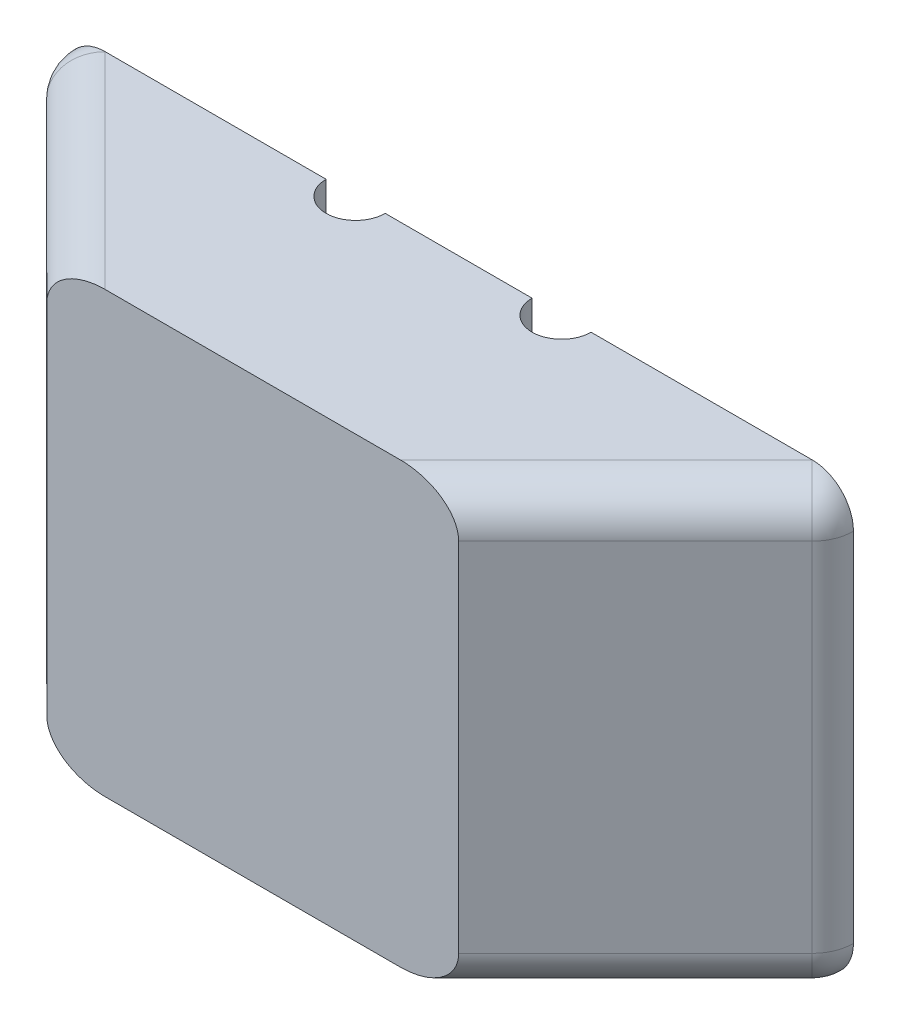
ISO-10303-21;
HEADER;
FILE_DESCRIPTION(('STEP AP214'),'2;1');
FILE_NAME('part.step','',(''),(''),'','','');
FILE_SCHEMA(('AUTOMOTIVE_DESIGN { 1 0 10303 214 1 1 1 1 }'));
ENDSEC;
DATA;
#1=APPLICATION_CONTEXT('core data for automotive mechanical design processes');
#2=APPLICATION_PROTOCOL_DEFINITION('international standard','automotive_design',2000,#1);
#3=PRODUCT_CONTEXT('',#1,'mechanical');
#4=PRODUCT('Part','Part','',(#3));
#5=PRODUCT_RELATED_PRODUCT_CATEGORY('part','',(#4));
#6=PRODUCT_DEFINITION_FORMATION('','',#4);
#7=PRODUCT_DEFINITION_CONTEXT('part definition',#1,'design');
#8=PRODUCT_DEFINITION('design','',#6,#7);
#9=PRODUCT_DEFINITION_SHAPE('','',#8);
#10=(LENGTH_UNIT() NAMED_UNIT(*) SI_UNIT(.MILLI.,.METRE.));
#11=(NAMED_UNIT(*) PLANE_ANGLE_UNIT() SI_UNIT($,.RADIAN.));
#12=(NAMED_UNIT(*) SI_UNIT($,.STERADIAN.) SOLID_ANGLE_UNIT());
#13=UNCERTAINTY_MEASURE_WITH_UNIT(LENGTH_MEASURE(1.E-05),#10,'distance_accuracy_value','');
#14=(GEOMETRIC_REPRESENTATION_CONTEXT(3) GLOBAL_UNCERTAINTY_ASSIGNED_CONTEXT((#13)) GLOBAL_UNIT_ASSIGNED_CONTEXT((#10,
#11,#12)) REPRESENTATION_CONTEXT('',''));
#15=CARTESIAN_POINT('',(0.,0.,0.));
#16=DIRECTION('',(0.,0.,1.));
#17=DIRECTION('',(1.,0.,0.));
#18=AXIS2_PLACEMENT_3D('',#15,#16,#17);
#19=CARTESIAN_POINT('',(-14.9906550373799,32.,15.0093449698787));
#20=DIRECTION('',(0.70666611811519,0.,-0.70754716981132));
#21=DIRECTION('',(-0.70754716981132,0.,-0.70666611811519));
#22=AXIS2_PLACEMENT_3D('',#19,#20,#21);
#23=PLANE('',#22);
#24=DIRECTION('',(0.,-1.,0.));
#25=VECTOR('',#24,1.);
#26=CARTESIAN_POINT('',(-27.877358490566,32.,2.13868829409393));
#27=LINE('',#26,#25);
#28=CARTESIAN_POINT('',(-27.877358490566,29.,2.13868829409393));
#29=VERTEX_POINT('',#28);
#30=CARTESIAN_POINT('',(-27.877358490566,3.,2.13868829409393));
#31=VERTEX_POINT('',#30);
#32=EDGE_CURVE('E286',#29,#31,#27,.T.);
#33=ORIENTED_EDGE('',*,*,#32,.T.);
#34=DIRECTION('',(0.70754716981132,0.,0.70666611811519));
#35=VECTOR('',#34,1.);
#36=CARTESIAN_POINT('',(-14.9906550373799,3.,15.0093449698787));
#37=LINE('',#36,#35);
#38=CARTESIAN_POINT('',(-15.,3.,15.0000116437904));
#39=VERTEX_POINT('',#38);
#40=EDGE_CURVE('E280',#31,#39,#37,.T.);
#41=ORIENTED_EDGE('',*,*,#40,.T.);
#42=DIRECTION('',(0.,-1.,0.));
#43=VECTOR('',#42,1.);
#44=CARTESIAN_POINT('',(-15.,32.,15.0000116437904));
#45=LINE('',#44,#43);
#46=CARTESIAN_POINT('',(-15.,29.,15.0000116437904));
#47=VERTEX_POINT('',#46);
#48=EDGE_CURVE('E300',#47,#39,#45,.T.);
#49=ORIENTED_EDGE('',*,*,#48,.F.);
#50=DIRECTION('',(0.70754716981132,0.,0.70666611811519));
#51=VECTOR('',#50,1.);
#52=CARTESIAN_POINT('',(-30.,29.,0.018689939748357));
#53=LINE('',#52,#51);
#54=EDGE_CURVE('E283',#47,#29,#53,.F.);
#55=ORIENTED_EDGE('',*,*,#54,.T.);
#56=EDGE_LOOP('',(#33,#41,#49,#55));
#57=FACE_BOUND('',#56,.T.);
#58=ADVANCED_FACE('F43',(#57),#23,.F.);
#59=CARTESIAN_POINT('',(0.,32.,15.0000116437904));
#60=DIRECTION('',(0.,0.,1.));
#61=DIRECTION('',(1.,0.,0.));
#62=AXIS2_PLACEMENT_3D('',#59,#60,#61);
#63=PLANE('',#62);
#64=ORIENTED_EDGE('',*,*,#48,.T.);
#65=CARTESIAN_POINT('',(-10.7547136857197,3.,15.0000116437904));
#66=DIRECTION('',(0.,0.,1.));
#67=DIRECTION('',(1.,0.,0.));
#68=AXIS2_PLACEMENT_3D('',#65,#66,#67);
#69=ELLIPSE('',#68,4.2452863142803,3.);
#70=CARTESIAN_POINT('',(-10.7547136857197,0.,15.0000116437904));
#71=VERTEX_POINT('',#70);
#72=EDGE_CURVE('E268',#39,#71,#69,.T.);
#73=ORIENTED_EDGE('',*,*,#72,.T.);
#74=DIRECTION('',(-1.,0.,0.));
#75=VECTOR('',#74,1.);
#76=CARTESIAN_POINT('',(0.,0.,15.0000116437904));
#77=LINE('',#76,#75);
#78=CARTESIAN_POINT('',(10.7547136857197,0.,15.0000116437904));
#79=VERTEX_POINT('',#78);
#80=EDGE_CURVE('E225',#79,#71,#77,.T.);
#81=ORIENTED_EDGE('',*,*,#80,.F.);
#82=CARTESIAN_POINT('',(10.7547136857197,3.,15.0000116437904));
#83=DIRECTION('',(0.,0.,1.));
#84=DIRECTION('',(1.,0.,0.));
#85=AXIS2_PLACEMENT_3D('',#82,#83,#84);
#86=ELLIPSE('',#85,4.2452863142803,3.);
#87=CARTESIAN_POINT('',(15.,3.,15.0000116437904));
#88=VERTEX_POINT('',#87);
#89=EDGE_CURVE('E277',#79,#88,#86,.T.);
#90=ORIENTED_EDGE('',*,*,#89,.T.);
#91=DIRECTION('',(0.,-1.,0.));
#92=VECTOR('',#91,1.);
#93=CARTESIAN_POINT('',(15.,32.,15.0000116437904));
#94=LINE('',#93,#92);
#95=CARTESIAN_POINT('',(15.,29.,15.0000116437904));
#96=VERTEX_POINT('',#95);
#97=EDGE_CURVE('E304',#96,#88,#94,.T.);
#98=ORIENTED_EDGE('',*,*,#97,.F.);
#99=CARTESIAN_POINT('',(10.7547136857197,29.,15.0000116437904));
#100=DIRECTION('',(0.,0.,1.));
#101=DIRECTION('',(-1.,0.,0.));
#102=AXIS2_PLACEMENT_3D('',#99,#100,#101);
#103=ELLIPSE('',#102,4.2452863142803,3.);
#104=CARTESIAN_POINT('',(10.7547136857197,32.,15.0000116437904));
#105=VERTEX_POINT('',#104);
#106=EDGE_CURVE('E274',#96,#105,#103,.T.);
#107=ORIENTED_EDGE('',*,*,#106,.T.);
#108=DIRECTION('',(-1.,0.,0.));
#109=VECTOR('',#108,1.);
#110=CARTESIAN_POINT('',(0.,32.,15.0000116437904));
#111=LINE('',#110,#109);
#112=CARTESIAN_POINT('',(-10.7547136857197,32.,15.0000116437904));
#113=VERTEX_POINT('',#112);
#114=EDGE_CURVE('E308',#105,#113,#111,.T.);
#115=ORIENTED_EDGE('',*,*,#114,.T.);
#116=CARTESIAN_POINT('',(-10.7547136857197,29.,15.0000116437904));
#117=DIRECTION('',(0.,0.,1.));
#118=DIRECTION('',(-1.,0.,0.));
#119=AXIS2_PLACEMENT_3D('',#116,#117,#118);
#120=ELLIPSE('',#119,4.2452863142803,3.);
#121=EDGE_CURVE('E271',#113,#47,#120,.T.);
#122=ORIENTED_EDGE('',*,*,#121,.T.);
#123=EDGE_LOOP('',(#64,#73,#81,#90,#98,#107,#115,#122));
#124=FACE_BOUND('',#123,.T.);
#125=ADVANCED_FACE('F424',(#124),#63,.T.);
#126=CARTESIAN_POINT('',(14.9906550373799,32.,15.0093449698787));
#127=DIRECTION('',(0.70666611811519,0.,0.70754716981132));
#128=DIRECTION('',(0.70754716981132,0.,-0.70666611811519));
#129=AXIS2_PLACEMENT_3D('',#126,#127,#128);
#130=PLANE('',#129);
#131=DIRECTION('',(0.,-1.,0.));
#132=VECTOR('',#131,1.);
#133=CARTESIAN_POINT('',(27.877358490566,32.,2.13868829409393));
#134=LINE('',#133,#132);
#135=CARTESIAN_POINT('',(27.877358490566,3.,2.13868829409393));
#136=VERTEX_POINT('',#135);
#137=CARTESIAN_POINT('',(27.877358490566,29.,2.13868829409393));
#138=VERTEX_POINT('',#137);
#139=EDGE_CURVE('E247',#136,#138,#134,.F.);
#140=ORIENTED_EDGE('',*,*,#139,.T.);
#141=DIRECTION('',(-0.70754716981132,0.,0.70666611811519));
#142=VECTOR('',#141,1.);
#143=CARTESIAN_POINT('',(14.9906550373799,29.,15.0093449698787));
#144=LINE('',#143,#142);
#145=EDGE_CURVE('E178',#138,#96,#144,.T.);
#146=ORIENTED_EDGE('',*,*,#145,.T.);
#147=ORIENTED_EDGE('',*,*,#97,.T.);
#148=DIRECTION('',(-0.70754716981132,0.,0.70666611811519));
#149=VECTOR('',#148,1.);
#150=CARTESIAN_POINT('',(30.,3.,0.0186899397483501));
#151=LINE('',#150,#149);
#152=EDGE_CURVE('E251',#88,#136,#151,.F.);
#153=ORIENTED_EDGE('',*,*,#152,.T.);
#154=EDGE_LOOP('',(#140,#146,#147,#153));
#155=FACE_BOUND('',#154,.T.);
#156=ADVANCED_FACE('F393',(#155),#130,.T.);
#157=CARTESIAN_POINT('',(0.,32.,0.));
#158=DIRECTION('',(0.,1.,0.));
#159=DIRECTION('',(0.,0.,1.));
#160=AXIS2_PLACEMENT_3D('',#157,#158,#159);
#161=PLANE('',#160);
#162=DIRECTION('',(1.,0.,0.));
#163=VECTOR('',#162,1.);
#164=CARTESIAN_POINT('',(0.,32.,0.));
#165=LINE('',#164,#163);
#166=CARTESIAN_POINT('',(-25.7413333333334,32.,0.));
#167=VERTEX_POINT('',#166);
#168=CARTESIAN_POINT('',(-9.64999346728504,32.,0.));
#169=VERTEX_POINT('',#168);
#170=EDGE_CURVE('E172',#167,#169,#165,.T.);
#171=ORIENTED_EDGE('',*,*,#170,.F.);
#172=DIRECTION('',(-0.706666118115192,0.,0.707547169811318));
#173=VECTOR('',#172,1.);
#174=CARTESIAN_POINT('',(-27.8773584905661,32.,2.13868829409393));
#175=LINE('',#174,#173);
#176=CARTESIAN_POINT('',(-25.7573601362205,32.,0.0160467846599707));
#177=VERTEX_POINT('',#176);
#178=EDGE_CURVE('E257',#167,#177,#175,.T.);
#179=ORIENTED_EDGE('',*,*,#178,.T.);
#180=DIRECTION('',(0.70754716981132,0.,0.70666611811519));
#181=VECTOR('',#180,1.);
#182=CARTESIAN_POINT('',(-12.8800016456545,32.,12.8773701343564));
#183=LINE('',#182,#181);
#184=EDGE_CURVE('E254',#177,#113,#183,.T.);
#185=ORIENTED_EDGE('',*,*,#184,.T.);
#186=ORIENTED_EDGE('',*,*,#114,.F.);
#187=DIRECTION('',(-0.70754716981132,0.,0.70666611811519));
#188=VECTOR('',#187,1.);
#189=CARTESIAN_POINT('',(12.8706566830343,32.,12.8867034604447));
#190=LINE('',#189,#188);
#191=CARTESIAN_POINT('',(25.7573601362205,32.,0.0160467846599665));
#192=VERTEX_POINT('',#191);
#193=EDGE_CURVE('E260',#105,#192,#190,.F.);
#194=ORIENTED_EDGE('',*,*,#193,.T.);
#195=DIRECTION('',(0.706666118115192,0.,0.707547169811318));
#196=VECTOR('',#195,1.);
#197=CARTESIAN_POINT('',(12.8867034531861,32.,-12.8706566757848));
#198=LINE('',#197,#196);
#199=CARTESIAN_POINT('',(25.7413333333334,32.,0.));
#200=VERTEX_POINT('',#199);
#201=EDGE_CURVE('E264',#192,#200,#198,.F.);
#202=ORIENTED_EDGE('',*,*,#201,.T.);
#203=CARTESIAN_POINT('',(9.6499949227572,32.,0.));
#204=VERTEX_POINT('',#203);
#205=EDGE_CURVE('E336',#204,#200,#165,.T.);
#206=ORIENTED_EDGE('',*,*,#205,.F.);
#207=CARTESIAN_POINT('',(7.5,32.,-0.00467248523580413));
#208=DIRECTION('',(0.,1.,0.));
#209=DIRECTION('',(0.,0.,1.));
#210=AXIS2_PLACEMENT_3D('',#207,#208,#209);
#211=CIRCLE('',#210,2.15);
#212=CARTESIAN_POINT('',(5.3500050772428,32.,0.));
#213=VERTEX_POINT('',#212);
#214=EDGE_CURVE('E315',#213,#204,#211,.T.);
#215=ORIENTED_EDGE('',*,*,#214,.F.);
#216=CARTESIAN_POINT('',(-5.3500036217667,32.,0.));
#217=VERTEX_POINT('',#216);
#218=EDGE_CURVE('E344',#217,#213,#165,.T.);
#219=ORIENTED_EDGE('',*,*,#218,.F.);
#220=CARTESIAN_POINT('',(-7.49999854452587,32.,0.00467248432904661));
#221=DIRECTION('',(0.,1.,0.));
#222=DIRECTION('',(0.,0.,1.));
#223=AXIS2_PLACEMENT_3D('',#220,#221,#222);
#224=CIRCLE('',#223,2.15);
#225=EDGE_CURVE('E200',#169,#217,#224,.T.);
#226=ORIENTED_EDGE('',*,*,#225,.F.);
#227=EDGE_LOOP('',(#171,#179,#185,#186,#194,#202,#206,#215,#219,#226));
#228=FACE_BOUND('',#227,.T.);
#229=ADVANCED_FACE('F408',(#228),#161,.T.);
#230=CARTESIAN_POINT('',(0.,0.,0.));
#231=DIRECTION('',(0.,1.,0.));
#232=DIRECTION('',(0.,0.,1.));
#233=AXIS2_PLACEMENT_3D('',#230,#231,#232);
#234=PLANE('',#233);
#235=DIRECTION('',(-0.706666118115192,0.,0.707547169811318));
#236=VECTOR('',#235,1.);
#237=CARTESIAN_POINT('',(-12.8867034531861,0.,-12.8706566757848));
#238=LINE('',#237,#236);
#239=CARTESIAN_POINT('',(-25.7573601362205,0.,0.0160467846599734));
#240=VERTEX_POINT('',#239);
#241=CARTESIAN_POINT('',(-25.7413333333334,0.,0.));
#242=VERTEX_POINT('',#241);
#243=EDGE_CURVE('E185',#240,#242,#238,.F.);
#244=ORIENTED_EDGE('',*,*,#243,.T.);
#245=DIRECTION('',(1.,0.,0.));
#246=VECTOR('',#245,1.);
#247=CARTESIAN_POINT('',(0.,0.,0.));
#248=LINE('',#247,#246);
#249=CARTESIAN_POINT('',(-9.64999346728504,0.,0.));
#250=VERTEX_POINT('',#249);
#251=EDGE_CURVE('E169',#242,#250,#248,.T.);
#252=ORIENTED_EDGE('',*,*,#251,.T.);
#253=CARTESIAN_POINT('',(-7.49999854452587,0.,0.00467248432904661));
#254=DIRECTION('',(0.,1.,0.));
#255=DIRECTION('',(0.,0.,1.));
#256=AXIS2_PLACEMENT_3D('',#253,#254,#255);
#257=CIRCLE('',#256,2.15);
#258=CARTESIAN_POINT('',(-5.3500036217667,0.,0.));
#259=VERTEX_POINT('',#258);
#260=EDGE_CURVE('E183',#250,#259,#257,.T.);
#261=ORIENTED_EDGE('',*,*,#260,.T.);
#262=CARTESIAN_POINT('',(5.3500050772428,0.,0.));
#263=VERTEX_POINT('',#262);
#264=EDGE_CURVE('E67',#259,#263,#248,.T.);
#265=ORIENTED_EDGE('',*,*,#264,.T.);
#266=CARTESIAN_POINT('',(7.5,0.,-0.00467248523580413));
#267=DIRECTION('',(0.,1.,0.));
#268=DIRECTION('',(0.,0.,1.));
#269=AXIS2_PLACEMENT_3D('',#266,#267,#268);
#270=CIRCLE('',#269,2.15);
#271=CARTESIAN_POINT('',(9.6499949227572,0.,0.));
#272=VERTEX_POINT('',#271);
#273=EDGE_CURVE('E191',#263,#272,#270,.T.);
#274=ORIENTED_EDGE('',*,*,#273,.T.);
#275=CARTESIAN_POINT('',(25.7413333333334,0.,0.));
#276=VERTEX_POINT('',#275);
#277=EDGE_CURVE('E59',#272,#276,#248,.T.);
#278=ORIENTED_EDGE('',*,*,#277,.T.);
#279=DIRECTION('',(0.706666118115192,0.,0.707547169811318));
#280=VECTOR('',#279,1.);
#281=CARTESIAN_POINT('',(27.8773584905661,0.,2.13868829409393));
#282=LINE('',#281,#280);
#283=CARTESIAN_POINT('',(25.7573601362205,0.,0.016046784659967));
#284=VERTEX_POINT('',#283);
#285=EDGE_CURVE('E294',#276,#284,#282,.T.);
#286=ORIENTED_EDGE('',*,*,#285,.T.);
#287=DIRECTION('',(-0.70754716981132,0.,0.70666611811519));
#288=VECTOR('',#287,1.);
#289=CARTESIAN_POINT('',(12.8800016456545,0.,12.8773701343564));
#290=LINE('',#289,#288);
#291=EDGE_CURVE('E297',#284,#79,#290,.T.);
#292=ORIENTED_EDGE('',*,*,#291,.T.);
#293=ORIENTED_EDGE('',*,*,#80,.T.);
#294=DIRECTION('',(0.70754716981132,0.,0.70666611811519));
#295=VECTOR('',#294,1.);
#296=CARTESIAN_POINT('',(-12.8706566830343,0.,12.8867034604447));
#297=LINE('',#296,#295);
#298=EDGE_CURVE('E291',#71,#240,#297,.F.);
#299=ORIENTED_EDGE('',*,*,#298,.T.);
#300=EDGE_LOOP('',(#244,#252,#261,#265,#274,#278,#286,#292,#293,#299));
#301=FACE_BOUND('',#300,.T.);
#302=ADVANCED_FACE('F182',(#301),#234,.F.);
#303=CARTESIAN_POINT('',(-12.8867034531861,29.,-12.8706566757848));
#304=DIRECTION('',(0.706666118115192,0.,-0.707547169811318));
#305=DIRECTION('',(-0.707547169811318,0.,-0.706666118115192));
#306=AXIS2_PLACEMENT_3D('',#303,#304,#305);
#307=CYLINDRICAL_SURFACE('',#306,3.);
#308=CARTESIAN_POINT('',(-25.7413333333334,29.,0.));
#309=DIRECTION('',(0.,0.,1.));
#310=DIRECTION('',(1.,0.,0.));
#311=AXIS2_PLACEMENT_3D('',#308,#309,#310);
#312=ELLIPSE('',#311,4.24000000000002,3.);
#313=CARTESIAN_POINT('',(-25.773426927566,31.9999140585887,0.));
#314=VERTEX_POINT('',#313);
#315=EDGE_CURVE('E345',#314,#167,#312,.F.);
#316=ORIENTED_EDGE('',*,*,#315,.F.);
#317=CARTESIAN_POINT('',(-25.7573601362205,29.,0.0160467846599707));
#318=DIRECTION('',(-0.706666118115192,0.,0.707547169811318));
#319=DIRECTION('',(0.707547169811318,0.,0.706666118115192));
#320=AXIS2_PLACEMENT_3D('',#317,#318,#319);
#321=CIRCLE('',#320,3.);
#322=EDGE_CURVE('E221',#177,#314,#321,.T.);
#323=ORIENTED_EDGE('',*,*,#322,.F.);
#324=ORIENTED_EDGE('',*,*,#178,.F.);
#325=EDGE_LOOP('',(#316,#323,#324));
#326=FACE_BOUND('',#325,.T.);
#327=ADVANCED_FACE('F457',(#326),#307,.T.);
#328=CARTESIAN_POINT('',(-12.8706566830343,29.,12.8867034604447));
#329=DIRECTION('',(-0.70754716981132,0.,-0.70666611811519));
#330=DIRECTION('',(-0.70666611811519,0.,0.70754716981132));
#331=AXIS2_PLACEMENT_3D('',#328,#329,#330);
#332=CYLINDRICAL_SURFACE('',#331,3.);
#333=ORIENTED_EDGE('',*,*,#121,.F.);
#334=ORIENTED_EDGE('',*,*,#184,.F.);
#335=CARTESIAN_POINT('',(-25.7573601362205,29.,0.0160467846599724));
#336=DIRECTION('',(-0.70754716981132,0.,-0.706666118115189));
#337=DIRECTION('',(-0.706666118115189,0.,0.70754716981132));
#338=AXIS2_PLACEMENT_3D('',#335,#336,#337);
#339=CIRCLE('',#338,3.);
#340=EDGE_CURVE('E226',#29,#177,#339,.T.);
#341=ORIENTED_EDGE('',*,*,#340,.F.);
#342=ORIENTED_EDGE('',*,*,#54,.F.);
#343=EDGE_LOOP('',(#333,#334,#341,#342));
#344=FACE_BOUND('',#343,.T.);
#345=ADVANCED_FACE('F453',(#344),#332,.T.);
#346=CARTESIAN_POINT('',(-25.7573601362205,29.,0.0160467846599713));
#347=DIRECTION('',(0.,1.,0.));
#348=DIRECTION('',(-1.,0.,0.));
#349=AXIS2_PLACEMENT_3D('',#346,#347,#348);
#350=SPHERICAL_SURFACE('',#349,3.);
#351=CARTESIAN_POINT('',(-25.7573601362205,29.,0.));
#352=DIRECTION('',(0.,0.,1.));
#353=DIRECTION('',(1.,0.,0.));
#354=AXIS2_PLACEMENT_3D('',#351,#352,#353);
#355=CIRCLE('',#354,2.99995708314337);
#356=CARTESIAN_POINT('',(-28.7573172193638,29.,0.));
#357=VERTEX_POINT('',#356);
#358=EDGE_CURVE('E348',#357,#314,#355,.F.);
#359=ORIENTED_EDGE('',*,*,#358,.F.);
#360=CARTESIAN_POINT('',(-25.7573601362205,29.,0.0160467846599707));
#361=DIRECTION('',(0.,1.,0.));
#362=DIRECTION('',(0.,0.,1.));
#363=AXIS2_PLACEMENT_3D('',#360,#361,#362);
#364=CIRCLE('',#363,3.);
#365=EDGE_CURVE('E230',#29,#357,#364,.F.);
#366=ORIENTED_EDGE('',*,*,#365,.F.);
#367=ORIENTED_EDGE('',*,*,#340,.T.);
#368=ORIENTED_EDGE('',*,*,#322,.T.);
#369=EDGE_LOOP('',(#359,#366,#367,#368));
#370=FACE_BOUND('',#369,.T.);
#371=ADVANCED_FACE('F449',(#370),#350,.T.);
#372=CARTESIAN_POINT('',(-25.7573601362205,32.,0.0160467846599711));
#373=DIRECTION('',(0.,-1.,0.));
#374=DIRECTION('',(0.,0.,-1.));
#375=AXIS2_PLACEMENT_3D('',#372,#373,#374);
#376=CYLINDRICAL_SURFACE('',#375,3.);
#377=DIRECTION('',(0.,-1.,0.));
#378=VECTOR('',#377,1.);
#379=CARTESIAN_POINT('',(-28.7573172193638,32.,0.));
#380=LINE('',#379,#378);
#381=CARTESIAN_POINT('',(-28.7573172193638,3.,0.));
#382=VERTEX_POINT('',#381);
#383=EDGE_CURVE('E351',#382,#357,#380,.F.);
#384=ORIENTED_EDGE('',*,*,#383,.F.);
#385=CARTESIAN_POINT('',(-25.7573601362205,3.,0.016046784659972));
#386=DIRECTION('',(0.,-1.,0.));
#387=DIRECTION('',(0.,0.,-1.));
#388=AXIS2_PLACEMENT_3D('',#385,#386,#387);
#389=CIRCLE('',#388,3.);
#390=EDGE_CURVE('E234',#31,#382,#389,.T.);
#391=ORIENTED_EDGE('',*,*,#390,.F.);
#392=ORIENTED_EDGE('',*,*,#32,.F.);
#393=ORIENTED_EDGE('',*,*,#365,.T.);
#394=EDGE_LOOP('',(#384,#391,#392,#393));
#395=FACE_BOUND('',#394,.T.);
#396=ADVANCED_FACE('F445',(#395),#376,.T.);
#397=CARTESIAN_POINT('',(-12.8706566830343,3.,12.8867034604447));
#398=DIRECTION('',(0.70754716981132,0.,0.70666611811519));
#399=DIRECTION('',(0.70666611811519,0.,-0.70754716981132));
#400=AXIS2_PLACEMENT_3D('',#397,#398,#399);
#401=CYLINDRICAL_SURFACE('',#400,3.);
#402=ORIENTED_EDGE('',*,*,#72,.F.);
#403=ORIENTED_EDGE('',*,*,#40,.F.);
#404=CARTESIAN_POINT('',(-25.7573601362205,3.,0.0160467846599734));
#405=DIRECTION('',(-0.707547169811321,0.,-0.706666118115189));
#406=DIRECTION('',(-0.706666118115189,0.,0.707547169811321));
#407=AXIS2_PLACEMENT_3D('',#404,#405,#406);
#408=CIRCLE('',#407,3.);
#409=EDGE_CURVE('E238',#240,#31,#408,.T.);
#410=ORIENTED_EDGE('',*,*,#409,.F.);
#411=ORIENTED_EDGE('',*,*,#298,.F.);
#412=EDGE_LOOP('',(#402,#403,#410,#411));
#413=FACE_BOUND('',#412,.T.);
#414=ADVANCED_FACE('F441',(#413),#401,.T.);
#415=CARTESIAN_POINT('',(-25.7573601362205,3.,0.016046784659971));
#416=DIRECTION('',(-0.706666118115189,0.,0.70754716981132));
#417=DIRECTION('',(0.70754716981132,0.,0.706666118115189));
#418=AXIS2_PLACEMENT_3D('',#415,#416,#417);
#419=SPHERICAL_SURFACE('',#418,3.);
#420=CARTESIAN_POINT('',(-25.7573601362205,3.,0.));
#421=DIRECTION('',(0.,0.,1.));
#422=DIRECTION('',(1.,0.,0.));
#423=AXIS2_PLACEMENT_3D('',#420,#421,#422);
#424=CIRCLE('',#423,2.99995708314337);
#425=CARTESIAN_POINT('',(-25.773426927566,8.59414113311974E-05,0.));
#426=VERTEX_POINT('',#425);
#427=EDGE_CURVE('E354',#426,#382,#424,.F.);
#428=ORIENTED_EDGE('',*,*,#427,.F.);
#429=CARTESIAN_POINT('',(-25.7573601362205,3.,0.0160467846599711));
#430=DIRECTION('',(-0.706666118115192,0.,0.707547169811318));
#431=DIRECTION('',(0.707547169811318,0.,0.706666118115192));
#432=AXIS2_PLACEMENT_3D('',#429,#430,#431);
#433=CIRCLE('',#432,3.);
#434=EDGE_CURVE('E207',#240,#426,#433,.F.);
#435=ORIENTED_EDGE('',*,*,#434,.F.);
#436=ORIENTED_EDGE('',*,*,#409,.T.);
#437=ORIENTED_EDGE('',*,*,#390,.T.);
#438=EDGE_LOOP('',(#428,#435,#436,#437));
#439=FACE_BOUND('',#438,.T.);
#440=ADVANCED_FACE('F437',(#439),#419,.T.);
#441=CARTESIAN_POINT('',(-12.8867034531861,3.,-12.8706566757848));
#442=DIRECTION('',(-0.706666118115192,0.,0.707547169811318));
#443=DIRECTION('',(0.707547169811318,0.,0.706666118115192));
#444=AXIS2_PLACEMENT_3D('',#441,#442,#443);
#445=CYLINDRICAL_SURFACE('',#444,3.);
#446=CARTESIAN_POINT('',(-25.7413333333334,3.,0.));
#447=DIRECTION('',(0.,0.,1.));
#448=DIRECTION('',(-1.,0.,0.));
#449=AXIS2_PLACEMENT_3D('',#446,#447,#448);
#450=ELLIPSE('',#449,4.24000000000002,3.);
#451=EDGE_CURVE('E357',#242,#426,#450,.F.);
#452=ORIENTED_EDGE('',*,*,#451,.F.);
#453=ORIENTED_EDGE('',*,*,#243,.F.);
#454=ORIENTED_EDGE('',*,*,#434,.T.);
#455=EDGE_LOOP('',(#452,#453,#454));
#456=FACE_BOUND('',#455,.T.);
#457=ADVANCED_FACE('F434',(#456),#445,.T.);
#458=CARTESIAN_POINT('',(12.8706566830343,29.,12.8867034604447));
#459=DIRECTION('',(-0.70754716981132,0.,0.70666611811519));
#460=DIRECTION('',(0.70666611811519,0.,0.70754716981132));
#461=AXIS2_PLACEMENT_3D('',#458,#459,#460);
#462=CYLINDRICAL_SURFACE('',#461,3.);
#463=ORIENTED_EDGE('',*,*,#106,.F.);
#464=ORIENTED_EDGE('',*,*,#145,.F.);
#465=CARTESIAN_POINT('',(25.7573601362205,29.,0.0160467846599678));
#466=DIRECTION('',(0.707547169811319,0.,-0.70666611811519));
#467=DIRECTION('',(-0.70666611811519,0.,-0.707547169811319));
#468=AXIS2_PLACEMENT_3D('',#465,#466,#467);
#469=CIRCLE('',#468,3.);
#470=EDGE_CURVE('E203',#192,#138,#469,.T.);
#471=ORIENTED_EDGE('',*,*,#470,.F.);
#472=ORIENTED_EDGE('',*,*,#193,.F.);
#473=EDGE_LOOP('',(#463,#464,#471,#472));
#474=FACE_BOUND('',#473,.T.);
#475=ADVANCED_FACE('F45',(#474),#462,.T.);
#476=CARTESIAN_POINT('',(12.8867034531861,29.,-12.8706566757848));
#477=DIRECTION('',(0.706666118115192,0.,0.707547169811318));
#478=DIRECTION('',(0.707547169811318,0.,-0.706666118115192));
#479=AXIS2_PLACEMENT_3D('',#476,#477,#478);
#480=CYLINDRICAL_SURFACE('',#479,3.);
#481=CARTESIAN_POINT('',(25.7413333333334,29.,0.));
#482=DIRECTION('',(0.,0.,1.));
#483=DIRECTION('',(1.,0.,0.));
#484=AXIS2_PLACEMENT_3D('',#481,#482,#483);
#485=ELLIPSE('',#484,4.24000000000002,3.);
#486=CARTESIAN_POINT('',(25.773426927566,31.9999140585887,0.));
#487=VERTEX_POINT('',#486);
#488=EDGE_CURVE('E330',#200,#487,#485,.F.);
#489=ORIENTED_EDGE('',*,*,#488,.F.);
#490=ORIENTED_EDGE('',*,*,#201,.F.);
#491=CARTESIAN_POINT('',(25.7573601362205,29.,0.0160467846599677));
#492=DIRECTION('',(0.706666118115192,0.,0.707547169811317));
#493=DIRECTION('',(0.707547169811317,0.,-0.706666118115192));
#494=AXIS2_PLACEMENT_3D('',#491,#492,#493);
#495=CIRCLE('',#494,3.);
#496=EDGE_CURVE('E208',#487,#192,#495,.T.);
#497=ORIENTED_EDGE('',*,*,#496,.F.);
#498=EDGE_LOOP('',(#489,#490,#497));
#499=FACE_BOUND('',#498,.T.);
#500=ADVANCED_FACE('F410',(#499),#480,.T.);
#501=CARTESIAN_POINT('',(12.8867034531861,3.,-12.8706566757848));
#502=DIRECTION('',(-0.706666118115192,0.,-0.707547169811318));
#503=DIRECTION('',(-0.707547169811318,0.,0.706666118115192));
#504=AXIS2_PLACEMENT_3D('',#501,#502,#503);
#505=CYLINDRICAL_SURFACE('',#504,3.);
#506=CARTESIAN_POINT('',(25.7413333333334,3.,0.));
#507=DIRECTION('',(0.,0.,1.));
#508=DIRECTION('',(-1.,0.,0.));
#509=AXIS2_PLACEMENT_3D('',#506,#507,#508);
#510=ELLIPSE('',#509,4.24000000000002,3.);
#511=CARTESIAN_POINT('',(25.773426927566,8.59414113316311E-05,0.));
#512=VERTEX_POINT('',#511);
#513=EDGE_CURVE('E333',#512,#276,#510,.F.);
#514=ORIENTED_EDGE('',*,*,#513,.F.);
#515=CARTESIAN_POINT('',(25.7573601362205,3.,0.0160467846599658));
#516=DIRECTION('',(0.706666118115191,0.,0.707547169811318));
#517=DIRECTION('',(0.707547169811318,0.,-0.706666118115192));
#518=AXIS2_PLACEMENT_3D('',#515,#516,#517);
#519=CIRCLE('',#518,3.);
#520=EDGE_CURVE('E211',#284,#512,#519,.T.);
#521=ORIENTED_EDGE('',*,*,#520,.F.);
#522=ORIENTED_EDGE('',*,*,#285,.F.);
#523=EDGE_LOOP('',(#514,#521,#522));
#524=FACE_BOUND('',#523,.T.);
#525=ADVANCED_FACE('F376',(#524),#505,.T.);
#526=CARTESIAN_POINT('',(12.8706566830343,3.,12.8867034604447));
#527=DIRECTION('',(0.70754716981132,0.,-0.70666611811519));
#528=DIRECTION('',(-0.70666611811519,0.,-0.70754716981132));
#529=AXIS2_PLACEMENT_3D('',#526,#527,#528);
#530=CYLINDRICAL_SURFACE('',#529,3.);
#531=ORIENTED_EDGE('',*,*,#89,.F.);
#532=ORIENTED_EDGE('',*,*,#291,.F.);
#533=CARTESIAN_POINT('',(25.7573601362205,3.,0.0160467846599668));
#534=DIRECTION('',(0.70754716981132,0.,-0.70666611811519));
#535=DIRECTION('',(-0.70666611811519,0.,-0.70754716981132));
#536=AXIS2_PLACEMENT_3D('',#533,#534,#535);
#537=CIRCLE('',#536,3.);
#538=EDGE_CURVE('E215',#136,#284,#537,.T.);
#539=ORIENTED_EDGE('',*,*,#538,.F.);
#540=ORIENTED_EDGE('',*,*,#152,.F.);
#541=EDGE_LOOP('',(#531,#532,#539,#540));
#542=FACE_BOUND('',#541,.T.);
#543=ADVANCED_FACE('F386',(#542),#530,.T.);
#544=CARTESIAN_POINT('',(25.7573601362205,29.,0.0160467846599674));
#545=DIRECTION('',(0.,1.,0.));
#546=DIRECTION('',(0.,0.,1.));
#547=AXIS2_PLACEMENT_3D('',#544,#545,#546);
#548=SPHERICAL_SURFACE('',#547,3.);
#549=CARTESIAN_POINT('',(25.7573601362205,29.,0.));
#550=DIRECTION('',(0.,0.,1.));
#551=DIRECTION('',(1.,0.,0.));
#552=AXIS2_PLACEMENT_3D('',#549,#550,#551);
#553=CIRCLE('',#552,2.99995708314337);
#554=CARTESIAN_POINT('',(28.7573172193639,29.,0.));
#555=VERTEX_POINT('',#554);
#556=EDGE_CURVE('E324',#487,#555,#553,.F.);
#557=ORIENTED_EDGE('',*,*,#556,.F.);
#558=ORIENTED_EDGE('',*,*,#496,.T.);
#559=ORIENTED_EDGE('',*,*,#470,.T.);
#560=CARTESIAN_POINT('',(25.7573601362205,29.,0.0160467846599668));
#561=DIRECTION('',(0.,1.,0.));
#562=DIRECTION('',(0.,0.,1.));
#563=AXIS2_PLACEMENT_3D('',#560,#561,#562);
#564=CIRCLE('',#563,3.);
#565=EDGE_CURVE('E197',#555,#138,#564,.F.);
#566=ORIENTED_EDGE('',*,*,#565,.F.);
#567=EDGE_LOOP('',(#557,#558,#559,#566));
#568=FACE_BOUND('',#567,.T.);
#569=ADVANCED_FACE('F401',(#568),#548,.T.);
#570=CARTESIAN_POINT('',(25.7573601362205,3.,0.016046784659968));
#571=DIRECTION('',(0.,-1.,0.));
#572=DIRECTION('',(0.,0.,-1.));
#573=AXIS2_PLACEMENT_3D('',#570,#571,#572);
#574=SPHERICAL_SURFACE('',#573,3.);
#575=CARTESIAN_POINT('',(25.7573601362205,3.,0.));
#576=DIRECTION('',(0.,0.,1.));
#577=DIRECTION('',(1.,0.,0.));
#578=AXIS2_PLACEMENT_3D('',#575,#576,#577);
#579=CIRCLE('',#578,2.99995708314337);
#580=CARTESIAN_POINT('',(28.7573172193639,3.,0.));
#581=VERTEX_POINT('',#580);
#582=EDGE_CURVE('E327',#581,#512,#579,.F.);
#583=ORIENTED_EDGE('',*,*,#582,.F.);
#584=CARTESIAN_POINT('',(25.7573601362205,3.,0.0160467846599677));
#585=DIRECTION('',(0.,-1.,0.));
#586=DIRECTION('',(0.,0.,-1.));
#587=AXIS2_PLACEMENT_3D('',#584,#585,#586);
#588=CIRCLE('',#587,3.);
#589=EDGE_CURVE('E190',#136,#581,#588,.F.);
#590=ORIENTED_EDGE('',*,*,#589,.F.);
#591=ORIENTED_EDGE('',*,*,#538,.T.);
#592=ORIENTED_EDGE('',*,*,#520,.T.);
#593=EDGE_LOOP('',(#583,#590,#591,#592));
#594=FACE_BOUND('',#593,.T.);
#595=ADVANCED_FACE('F381',(#594),#574,.T.);
#596=CARTESIAN_POINT('',(25.7573601362205,32.,0.0160467846599677));
#597=DIRECTION('',(0.,-1.,0.));
#598=DIRECTION('',(0.,0.,-1.));
#599=AXIS2_PLACEMENT_3D('',#596,#597,#598);
#600=CYLINDRICAL_SURFACE('',#599,3.);
#601=DIRECTION('',(0.,-1.,0.));
#602=VECTOR('',#601,1.);
#603=CARTESIAN_POINT('',(28.7573172193639,32.,0.));
#604=LINE('',#603,#602);
#605=EDGE_CURVE('E319',#555,#581,#604,.T.);
#606=ORIENTED_EDGE('',*,*,#605,.F.);
#607=ORIENTED_EDGE('',*,*,#565,.T.);
#608=ORIENTED_EDGE('',*,*,#139,.F.);
#609=ORIENTED_EDGE('',*,*,#589,.T.);
#610=EDGE_LOOP('',(#606,#607,#608,#609));
#611=FACE_BOUND('',#610,.T.);
#612=ADVANCED_FACE('F389',(#611),#600,.T.);
#613=CARTESIAN_POINT('',(7.5,-31.,-0.00467248523580413));
#614=DIRECTION('',(0.,1.,0.));
#615=DIRECTION('',(0.,0.,1.));
#616=AXIS2_PLACEMENT_3D('',#613,#614,#615);
#617=CYLINDRICAL_SURFACE('',#616,2.15);
#618=ORIENTED_EDGE('',*,*,#214,.T.);
#619=DIRECTION('',(0.,1.,0.));
#620=VECTOR('',#619,1.);
#621=CARTESIAN_POINT('',(9.6499949227572,-31.,0.));
#622=LINE('',#621,#620);
#623=EDGE_CURVE('E337',#204,#272,#622,.F.);
#624=ORIENTED_EDGE('',*,*,#623,.T.);
#625=ORIENTED_EDGE('',*,*,#273,.F.);
#626=DIRECTION('',(0.,1.,0.));
#627=VECTOR('',#626,1.);
#628=CARTESIAN_POINT('',(5.3500050772428,-31.,0.));
#629=LINE('',#628,#627);
#630=EDGE_CURVE('E340',#263,#213,#629,.T.);
#631=ORIENTED_EDGE('',*,*,#630,.T.);
#632=EDGE_LOOP('',(#618,#624,#625,#631));
#633=FACE_BOUND('',#632,.T.);
#634=ADVANCED_FACE('F414',(#633),#617,.F.);
#635=CARTESIAN_POINT('',(-7.49999854452587,-31.,0.00467248432904661));
#636=DIRECTION('',(0.,1.,0.));
#637=DIRECTION('',(0.,0.,1.));
#638=AXIS2_PLACEMENT_3D('',#635,#636,#637);
#639=CYLINDRICAL_SURFACE('',#638,2.15);
#640=ORIENTED_EDGE('',*,*,#225,.T.);
#641=DIRECTION('',(0.,1.,0.));
#642=VECTOR('',#641,1.);
#643=CARTESIAN_POINT('',(-5.3500036217667,-31.,0.));
#644=LINE('',#643,#642);
#645=EDGE_CURVE('E11',#217,#259,#644,.F.);
#646=ORIENTED_EDGE('',*,*,#645,.T.);
#647=ORIENTED_EDGE('',*,*,#260,.F.);
#648=DIRECTION('',(0.,1.,0.));
#649=VECTOR('',#648,1.);
#650=CARTESIAN_POINT('',(-9.64999346728504,-31.,0.));
#651=LINE('',#650,#649);
#652=EDGE_CURVE('E52',#250,#169,#651,.T.);
#653=ORIENTED_EDGE('',*,*,#652,.T.);
#654=EDGE_LOOP('',(#640,#646,#647,#653));
#655=FACE_BOUND('',#654,.T.);
#656=ADVANCED_FACE('F188',(#655),#639,.F.);
#657=CARTESIAN_POINT('',(0.,0.,0.));
#658=DIRECTION('',(0.,0.,1.));
#659=DIRECTION('',(1.,0.,0.));
#660=AXIS2_PLACEMENT_3D('',#657,#658,#659);
#661=PLANE('',#660);
#662=ORIENTED_EDGE('',*,*,#315,.T.);
#663=ORIENTED_EDGE('',*,*,#170,.T.);
#664=ORIENTED_EDGE('',*,*,#652,.F.);
#665=ORIENTED_EDGE('',*,*,#251,.F.);
#666=ORIENTED_EDGE('',*,*,#451,.T.);
#667=ORIENTED_EDGE('',*,*,#427,.T.);
#668=ORIENTED_EDGE('',*,*,#383,.T.);
#669=ORIENTED_EDGE('',*,*,#358,.T.);
#670=EDGE_LOOP('',(#662,#663,#664,#665,#666,#667,#668,#669));
#671=FACE_BOUND('',#670,.T.);
#672=ADVANCED_FACE('F168',(#671),#661,.F.);
#673=ORIENTED_EDGE('',*,*,#264,.F.);
#674=ORIENTED_EDGE('',*,*,#645,.F.);
#675=ORIENTED_EDGE('',*,*,#218,.T.);
#676=ORIENTED_EDGE('',*,*,#630,.F.);
#677=EDGE_LOOP('',(#673,#674,#675,#676));
#678=FACE_BOUND('',#677,.T.);
#679=ADVANCED_FACE('F415',(#678),#661,.F.);
#680=ORIENTED_EDGE('',*,*,#605,.T.);
#681=ORIENTED_EDGE('',*,*,#582,.T.);
#682=ORIENTED_EDGE('',*,*,#513,.T.);
#683=ORIENTED_EDGE('',*,*,#277,.F.);
#684=ORIENTED_EDGE('',*,*,#623,.F.);
#685=ORIENTED_EDGE('',*,*,#205,.T.);
#686=ORIENTED_EDGE('',*,*,#488,.T.);
#687=ORIENTED_EDGE('',*,*,#556,.T.);
#688=EDGE_LOOP('',(#680,#681,#682,#683,#684,#685,#686,#687));
#689=FACE_BOUND('',#688,.T.);
#690=ADVANCED_FACE('F411',(#689),#661,.F.);
#691=CLOSED_SHELL('',(#58,#125,#156,#229,#302,#327,#345,#371,#396,#414,#440,#457,#475,#500,#525,
#543,#569,#595,#612,#634,#656,#672,#679,#690));
#692=MANIFOLD_SOLID_BREP('B2',#691);
#693=ADVANCED_BREP_SHAPE_REPRESENTATION('',(#18,#692),#14);
#694=SHAPE_DEFINITION_REPRESENTATION(#9,#693);
ENDSEC;
END-ISO-10303-21;
